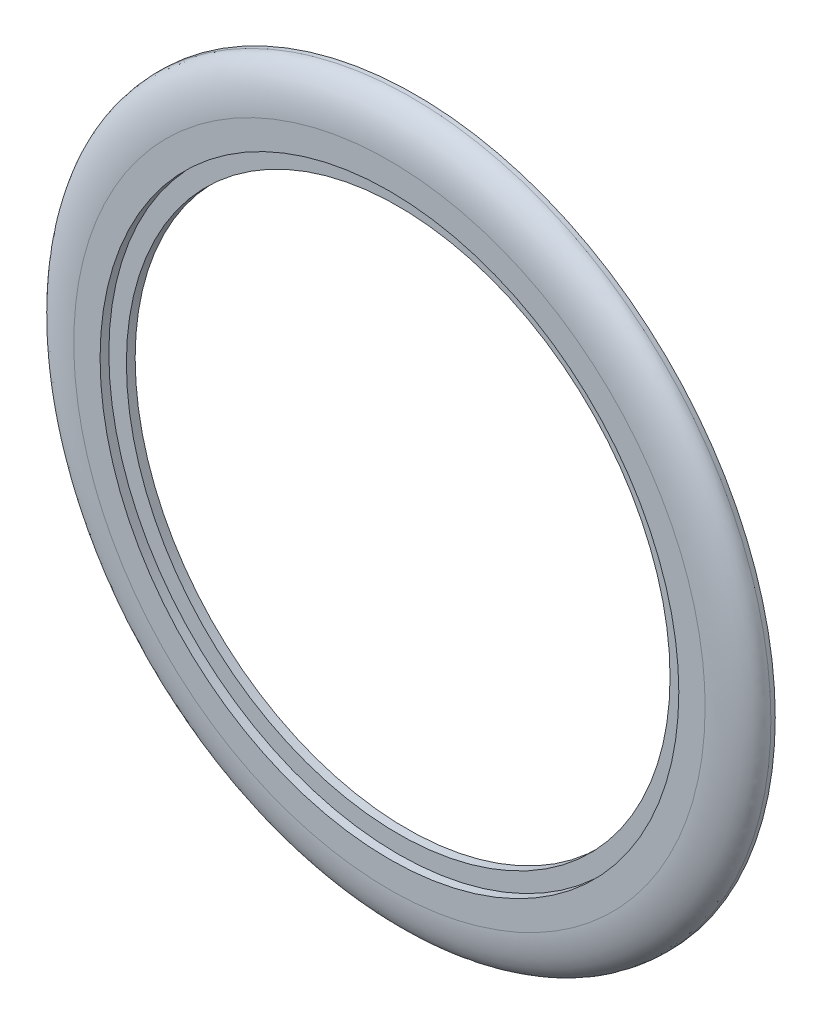
ISO-10303-21;
HEADER;
FILE_DESCRIPTION(('STEP AP214'),'2;1');
FILE_NAME('part.step','',(''),(''),'','','');
FILE_SCHEMA(('AUTOMOTIVE_DESIGN { 1 0 10303 214 1 1 1 1 }'));
ENDSEC;
DATA;
#1=APPLICATION_CONTEXT('core data for automotive mechanical design processes');
#2=APPLICATION_PROTOCOL_DEFINITION('international standard','automotive_design',2000,#1);
#3=PRODUCT_CONTEXT('',#1,'mechanical');
#4=PRODUCT('Part','Part','',(#3));
#5=PRODUCT_RELATED_PRODUCT_CATEGORY('part','',(#4));
#6=PRODUCT_DEFINITION_FORMATION('','',#4);
#7=PRODUCT_DEFINITION_CONTEXT('part definition',#1,'design');
#8=PRODUCT_DEFINITION('design','',#6,#7);
#9=PRODUCT_DEFINITION_SHAPE('','',#8);
#10=(LENGTH_UNIT() NAMED_UNIT(*) SI_UNIT(.MILLI.,.METRE.));
#11=(NAMED_UNIT(*) PLANE_ANGLE_UNIT() SI_UNIT($,.RADIAN.));
#12=(NAMED_UNIT(*) SI_UNIT($,.STERADIAN.) SOLID_ANGLE_UNIT());
#13=UNCERTAINTY_MEASURE_WITH_UNIT(LENGTH_MEASURE(1.E-05),#10,'distance_accuracy_value','');
#14=(GEOMETRIC_REPRESENTATION_CONTEXT(3) GLOBAL_UNCERTAINTY_ASSIGNED_CONTEXT((#13)) GLOBAL_UNIT_ASSIGNED_CONTEXT((#10,
#11,#12)) REPRESENTATION_CONTEXT('',''));
#15=CARTESIAN_POINT('',(0.,0.,0.));
#16=DIRECTION('',(0.,0.,1.));
#17=DIRECTION('',(1.,0.,0.));
#18=AXIS2_PLACEMENT_3D('',#15,#16,#17);
#19=CARTESIAN_POINT('',(0.,0.,-0.150151751733781));
#20=DIRECTION('',(0.,0.,1.));
#21=DIRECTION('',(1.,0.,0.));
#22=AXIS2_PLACEMENT_3D('',#19,#20,#21);
#23=CYLINDRICAL_SURFACE('',#22,15.5);
#24=CARTESIAN_POINT('',(0.,0.,1.));
#25=DIRECTION('',(0.,0.,1.));
#26=DIRECTION('',(1.,0.,0.));
#27=AXIS2_PLACEMENT_3D('',#24,#25,#26);
#28=CIRCLE('',#27,15.5);
#29=CARTESIAN_POINT('',(15.5,0.,1.));
#30=VERTEX_POINT('',#29);
#31=EDGE_CURVE('E154',#30,#30,#28,.T.);
#32=ORIENTED_EDGE('',*,*,#31,.T.);
#33=EDGE_LOOP('',(#32));
#34=FACE_BOUND('',#33,.T.);
#35=CARTESIAN_POINT('',(0.,0.,0.5));
#36=DIRECTION('',(0.,0.,-1.));
#37=DIRECTION('',(-1.,0.,0.));
#38=AXIS2_PLACEMENT_3D('',#35,#36,#37);
#39=CIRCLE('',#38,15.5);
#40=CARTESIAN_POINT('',(-15.5,0.,0.5));
#41=VERTEX_POINT('',#40);
#42=EDGE_CURVE('E52',#41,#41,#39,.F.);
#43=ORIENTED_EDGE('',*,*,#42,.F.);
#44=EDGE_LOOP('',(#43));
#45=FACE_BOUND('',#44,.T.);
#46=ADVANCED_FACE('F44',(#34,#45),#23,.F.);
#47=CARTESIAN_POINT('',(0.,0.,1.5));
#48=DIRECTION('',(0.,0.,-1.));
#49=DIRECTION('',(-1.,0.,0.));
#50=AXIS2_PLACEMENT_3D('',#47,#48,#49);
#51=CYLINDRICAL_SURFACE('',#50,20.5);
#52=CARTESIAN_POINT('',(20.5,0.,0.25));
#53=CARTESIAN_POINT('',(20.5,1.34172186178781,0.25));
#54=CARTESIAN_POINT('',(20.3678551983372,2.68341054890061,0.25));
#55=CARTESIAN_POINT('',(19.8443412981953,5.31529265376065,0.25));
#56=CARTESIAN_POINT('',(19.4529851438268,6.60542099706243,0.25));
#57=CARTESIAN_POINT('',(18.426075689136,9.08459972990625,0.25));
#58=CARTESIAN_POINT('',(17.7905477795981,10.2735888206708,0.25));
#59=CARTESIAN_POINT('',(16.2997063248063,12.5047907331329,0.25));
#60=CARTESIAN_POINT('',(15.4444296412554,13.5469483873931,0.25));
#61=CARTESIAN_POINT('',(13.5469483873931,15.4444296412554,0.25));
#62=CARTESIAN_POINT('',(12.5047907331328,16.2997063248063,0.25));
#63=CARTESIAN_POINT('',(10.2735888206708,17.7905477795981,0.25));
#64=CARTESIAN_POINT('',(9.08459972990589,18.4260756891361,0.25));
#65=CARTESIAN_POINT('',(6.60542099706278,19.4529851438267,0.25));
#66=CARTESIAN_POINT('',(5.31529265375978,19.8443412981955,0.25));
#67=CARTESIAN_POINT('',(2.6834105489015,20.367855198337,0.25));
#68=CARTESIAN_POINT('',(1.34172186178046,20.5,0.25));
#69=CARTESIAN_POINT('',(-1.34172186178045,20.5,0.25));
#70=CARTESIAN_POINT('',(-2.68341054890148,20.367855198337,0.25));
#71=CARTESIAN_POINT('',(-5.31529265375976,19.8443412981955,0.25));
#72=CARTESIAN_POINT('',(-6.60542099706352,19.4529851438264,0.25));
#73=CARTESIAN_POINT('',(-9.08459972990518,18.4260756891364,0.25));
#74=CARTESIAN_POINT('',(-10.27358882067,17.7905477795986,0.25));
#75=CARTESIAN_POINT('',(-12.5047907331337,16.2997063248057,0.25));
#76=CARTESIAN_POINT('',(-13.5469483873938,15.4444296412547,0.25));
#77=CARTESIAN_POINT('',(-15.4444296412547,13.5469483873937,0.25));
#78=CARTESIAN_POINT('',(-16.2997063248051,12.5047907331346,0.25));
#79=CARTESIAN_POINT('',(-17.7905477795992,10.2735888206691,0.25));
#80=CARTESIAN_POINT('',(-18.4260756891358,9.08459972990664,0.25));
#81=CARTESIAN_POINT('',(-19.452985143827,6.6054209970621,0.25));
#82=CARTESIAN_POINT('',(-19.8443412981954,5.31529265376027,0.25));
#83=CARTESIAN_POINT('',(-20.3678551983371,2.68341054890101,0.25));
#84=CARTESIAN_POINT('',(-20.5,1.34172186178046,0.25));
#85=CARTESIAN_POINT('',(-20.5,-1.34172186178045,0.25));
#86=CARTESIAN_POINT('',(-20.3678551983371,-2.68341054890098,0.25));
#87=CARTESIAN_POINT('',(-19.8443412981954,-5.31529265376024,0.25));
#88=CARTESIAN_POINT('',(-19.4529851438273,-6.60542099706117,0.25));
#89=CARTESIAN_POINT('',(-18.4260756891355,-9.08459972990746,0.25));
#90=CARTESIAN_POINT('',(-17.7905477795993,-10.2735888206691,0.25));
#91=CARTESIAN_POINT('',(-16.2997063248051,-12.5047907331346,0.25));
#92=CARTESIAN_POINT('',(-15.4444296412557,-13.5469483873927,0.25));
#93=CARTESIAN_POINT('',(-13.5469483873927,-15.4444296412557,0.25));
#94=CARTESIAN_POINT('',(-12.5047907331339,-16.2997063248055,0.25));
#95=CARTESIAN_POINT('',(-10.2735888206698,-17.7905477795988,0.25));
#96=CARTESIAN_POINT('',(-9.08459972990617,-18.426075689136,0.25));
#97=CARTESIAN_POINT('',(-6.60542099706256,-19.4529851438268,0.25));
#98=CARTESIAN_POINT('',(-5.3152926537596,-19.8443412981955,0.25));
#99=CARTESIAN_POINT('',(-2.68341054890171,-20.3678551983369,0.25));
#100=CARTESIAN_POINT('',(-1.34172186178042,-20.5,0.25));
#101=CARTESIAN_POINT('',(1.34172186178049,-20.5,0.25));
#102=CARTESIAN_POINT('',(2.68341054890079,-20.3678551983371,0.25));
#103=CARTESIAN_POINT('',(5.31529265376044,-19.8443412981953,0.25));
#104=CARTESIAN_POINT('',(6.60542099706337,-19.4529851438264,0.25));
#105=CARTESIAN_POINT('',(9.08459972990525,-18.4260756891364,0.25));
#106=CARTESIAN_POINT('',(10.2735888206683,-17.7905477795997,0.25));
#107=CARTESIAN_POINT('',(12.5047907331353,-16.2997063248046,0.25));
#108=CARTESIAN_POINT('',(13.5469483873931,-15.4444296412553,0.25));
#109=CARTESIAN_POINT('',(15.4444296412553,-13.5469483873932,0.25));
#110=CARTESIAN_POINT('',(16.2997063248046,-12.5047907331354,0.25));
#111=CARTESIAN_POINT('',(17.7905477795997,-10.2735888206684,0.25));
#112=CARTESIAN_POINT('',(18.4260756891357,-9.0845997299069,0.25));
#113=CARTESIAN_POINT('',(19.4529851438271,-6.60542099706184,0.25));
#114=CARTESIAN_POINT('',(19.8443412981955,-5.3152926537597,0.25));
#115=CARTESIAN_POINT('',(20.367855198337,-2.68341054890161,0.25));
#116=CARTESIAN_POINT('',(20.5,-1.34172186178781,0.25));
#117=CARTESIAN_POINT('',(20.5,0.,0.25));
#118=(BOUNDED_CURVE() B_SPLINE_CURVE(3,(#52,#53,#54,#55,#56,#57,#58,#59,#60,#61,#62,#63,#64,#65,
#66,#67,#68,#69,#70,#71,#72,#73,#74,#75,#76,#77,#78,#79,#80,#81,#82,#83,#84,#85,#86,#87,#88,#89,
#90,#91,#92,#93,#94,#95,#96,#97,#98,#99,#100,#101,#102,#103,#104,#105,#106,#107,#108,#109,#110,
#111,#112,#113,#114,#115,#116,#117),.UNSPECIFIED.,.T.,.F.) B_SPLINE_CURVE_WITH_KNOTS((4,2,2,2,2,
2,2,2,2,2,2,2,2,2,2,2,2,2,2,2,2,2,2,2,2,2,2,2,2,2,2,2,4),(0.,0.196349540849362,
0.392699081698724,0.589048622548086,0.785398163397448,0.98174770424681,1.17809724509617,
1.37444678594553,1.5707963267949,1.76714586764426,1.96349540849362,2.15984494934298,
2.35619449019234,2.55254403104171,2.74889357189107,2.94524311274043,3.14159265358979,
3.33794219443916,3.53429173528852,3.73064127613788,3.92699081698724,4.1233403578366,
4.31968989868597,4.51603943953533,4.71238898038469,4.90873852123405,5.10508806208341,
5.30143760293278,5.49778714378214,5.6941366846315,5.89048622548086,6.08683576633022,
6.28318530717959),
.UNSPECIFIED.) CURVE() GEOMETRIC_REPRESENTATION_ITEM() RATIONAL_B_SPLINE_CURVE((1.,1.,1.,1.,1.,
1.,1.,1.,1.,1.,1.,1.,1.,1.,1.,1.,1.,1.,1.,1.,1.,1.,1.,1.,1.,1.,1.,1.,1.,1.,1.,1.,1.,1.,1.,1.,1.,
1.,1.,1.,1.,1.,1.,1.,1.,1.,1.,1.,1.,1.,1.,1.,1.,1.,1.,1.,1.,1.,1.,1.,1.,1.,1.,1.,1.,1.)) REPRESENTATION_ITEM(''));
#119=CARTESIAN_POINT('',(20.5,0.,0.25));
#120=VERTEX_POINT('',#119);
#121=EDGE_CURVE('E11',#120,#120,#118,.F.);
#122=ORIENTED_EDGE('',*,*,#121,.T.);
#123=EDGE_LOOP('',(#122));
#124=FACE_BOUND('',#123,.T.);
#125=CARTESIAN_POINT('',(0.,0.,0.));
#126=DIRECTION('',(0.,0.,1.));
#127=DIRECTION('',(1.,0.,0.));
#128=AXIS2_PLACEMENT_3D('',#125,#126,#127);
#129=CIRCLE('',#128,20.5);
#130=CARTESIAN_POINT('',(20.5,0.,0.));
#131=VERTEX_POINT('',#130);
#132=EDGE_CURVE('E64',#131,#131,#129,.T.);
#133=ORIENTED_EDGE('',*,*,#132,.T.);
#134=EDGE_LOOP('',(#133));
#135=FACE_BOUND('',#134,.T.);
#136=ADVANCED_FACE('F95',(#124,#135),#51,.T.);
#137=CARTESIAN_POINT('',(0.,0.,1.5));
#138=DIRECTION('',(0.,0.,1.));
#139=DIRECTION('',(1.,0.,0.));
#140=AXIS2_PLACEMENT_3D('',#137,#138,#139);
#141=PLANE('',#140);
#142=CARTESIAN_POINT('',(0.,0.,1.5));
#143=DIRECTION('',(0.,0.,1.));
#144=DIRECTION('',(1.,0.,0.));
#145=AXIS2_PLACEMENT_3D('',#142,#143,#144);
#146=CIRCLE('',#145,16.5);
#147=CARTESIAN_POINT('',(16.5,0.,1.5));
#148=VERTEX_POINT('',#147);
#149=EDGE_CURVE('E76',#148,#148,#146,.T.);
#150=ORIENTED_EDGE('',*,*,#149,.F.);
#151=EDGE_LOOP('',(#150));
#152=FACE_BOUND('',#151,.T.);
#153=CARTESIAN_POINT('',(18.,0.,1.5));
#154=CARTESIAN_POINT('',(18.,-1.17809724449661,1.5));
#155=CARTESIAN_POINT('',(17.8839704180491,-2.3561653600105,1.5));
#156=CARTESIAN_POINT('',(17.4242996764672,-4.66708623257016,1.5));
#157=CARTESIAN_POINT('',(17.0806698823861,-5.79988185107918,1.5));
#158=CARTESIAN_POINT('',(16.1789932880202,-7.9767217140641,1.5));
#159=CARTESIAN_POINT('',(15.6209687820875,-9.02071213522079,1.5));
#160=CARTESIAN_POINT('',(14.3119372608041,-10.9798162534849,1.5));
#161=CARTESIAN_POINT('',(13.5609626118337,-11.894881510882,1.5));
#162=CARTESIAN_POINT('',(11.8948815108819,-13.5609626118338,1.5));
#163=CARTESIAN_POINT('',(10.9798162534839,-14.3119372608041,1.5));
#164=CARTESIAN_POINT('',(9.02071213522179,-15.6209687820875,1.5));
#165=CARTESIAN_POINT('',(7.97672171406405,-16.1789932880222,1.5));
#166=CARTESIAN_POINT('',(5.79988185107913,-17.0806698823841,1.5));
#167=CARTESIAN_POINT('',(4.66708623256987,-17.4242996764651,1.5));
#168=CARTESIAN_POINT('',(2.35616536001072,-17.8839704180512,1.5));
#169=CARTESIAN_POINT('',(1.17809724449019,-18.,1.5));
#170=CARTESIAN_POINT('',(-1.17809724449013,-18.,1.5));
#171=CARTESIAN_POINT('',(-2.35616536001076,-17.8839704180512,1.5));
#172=CARTESIAN_POINT('',(-4.66708623256991,-17.4242996764651,1.5));
#173=CARTESIAN_POINT('',(-5.79988185107918,-17.0806698823841,1.5));
#174=CARTESIAN_POINT('',(-7.9767217140641,-16.1789932880222,1.5));
#175=CARTESIAN_POINT('',(-9.02071213522283,-15.6209687820875,1.5));
#176=CARTESIAN_POINT('',(-10.9798162534829,-14.3119372608041,1.5));
#177=CARTESIAN_POINT('',(-11.8948815108825,-13.5609626118353,1.5));
#178=CARTESIAN_POINT('',(-13.5609626118332,-11.8948815108804,1.5));
#179=CARTESIAN_POINT('',(-14.311937260804,-10.9798162534835,1.5));
#180=CARTESIAN_POINT('',(-15.6209687820877,-9.02071213522213,1.5));
#181=CARTESIAN_POINT('',(-16.1789932880207,-7.97672171406407,1.5));
#182=CARTESIAN_POINT('',(-17.0806698823857,-5.79988185107912,1.5));
#183=CARTESIAN_POINT('',(-17.4242996764653,-4.66708623256991,1.5));
#184=CARTESIAN_POINT('',(-17.883970418051,-2.35616536001068,1.5));
#185=CARTESIAN_POINT('',(-18.,-1.17809724449015,1.5));
#186=CARTESIAN_POINT('',(-18.,1.17809724449016,1.5));
#187=CARTESIAN_POINT('',(-17.883970418053,2.35616536001071,1.5));
#188=CARTESIAN_POINT('',(-17.4242996764633,4.66708623256993,1.5));
#189=CARTESIAN_POINT('',(-17.0806698823856,5.79988185107917,1.5));
#190=CARTESIAN_POINT('',(-16.1789932880207,7.97672171406412,1.5));
#191=CARTESIAN_POINT('',(-15.6209687820876,9.02071213522318,1.5));
#192=CARTESIAN_POINT('',(-14.311937260804,10.9798162534825,1.5));
#193=CARTESIAN_POINT('',(-13.5609626118343,11.8948815108825,1.5));
#194=CARTESIAN_POINT('',(-11.8948815108814,13.5609626118332,1.5));
#195=CARTESIAN_POINT('',(-10.9798162534835,14.311937260805,1.5));
#196=CARTESIAN_POINT('',(-9.02071213522213,15.6209687820866,1.5));
#197=CARTESIAN_POINT('',(-7.97672171406359,16.1789932880227,1.5));
#198=CARTESIAN_POINT('',(-5.79988185107966,17.0806698823836,1.5));
#199=CARTESIAN_POINT('',(-4.66708623256965,17.4242996764653,1.5));
#200=CARTESIAN_POINT('',(-2.35616536001094,17.883970418051,1.5));
#201=CARTESIAN_POINT('',(-1.17809724449015,18.,1.5));
#202=CARTESIAN_POINT('',(1.17809724449016,18.,1.5));
#203=CARTESIAN_POINT('',(2.35616536001096,17.883970418053,1.5));
#204=CARTESIAN_POINT('',(4.66708623256968,17.4242996764633,1.5));
#205=CARTESIAN_POINT('',(5.79988185107913,17.0806698823836,1.5));
#206=CARTESIAN_POINT('',(7.97672171406409,16.1789932880227,1.5));
#207=CARTESIAN_POINT('',(9.02071213522308,15.6209687820863,1.5));
#208=CARTESIAN_POINT('',(10.9798162534826,14.3119372608053,1.5));
#209=CARTESIAN_POINT('',(11.8948815108811,13.5609626118336,1.5));
#210=CARTESIAN_POINT('',(13.5609626118347,11.8948815108821,1.5));
#211=CARTESIAN_POINT('',(14.3119372608053,10.9798162534826,1.5));
#212=CARTESIAN_POINT('',(15.6209687820863,9.02071213522308,1.5));
#213=CARTESIAN_POINT('',(16.1789932880211,7.97672171406403,1.5));
#214=CARTESIAN_POINT('',(17.0806698823852,5.79988185107921,1.5));
#215=CARTESIAN_POINT('',(17.4242996764636,4.66708623256998,1.5));
#216=CARTESIAN_POINT('',(17.8839704180527,2.35616536001064,1.5));
#217=CARTESIAN_POINT('',(18.,1.17809724449661,1.5));
#218=CARTESIAN_POINT('',(18.,0.,1.5));
#219=(BOUNDED_CURVE() B_SPLINE_CURVE(3,(#153,#154,#155,#156,#157,#158,#159,#160,#161,#162,#163,
#164,#165,#166,#167,#168,#169,#170,#171,#172,#173,#174,#175,#176,#177,#178,#179,#180,#181,#182,
#183,#184,#185,#186,#187,#188,#189,#190,#191,#192,#193,#194,#195,#196,#197,#198,#199,#200,#201,
#202,#203,#204,#205,#206,#207,#208,#209,#210,#211,#212,#213,#214,#215,#216,#217,#218),
.UNSPECIFIED.,.T.,.F.) B_SPLINE_CURVE_WITH_KNOTS((4,2,2,2,2,2,2,2,2,2,2,2,2,2,2,2,2,2,2,2,2,2,2,
2,2,2,2,2,2,2,2,2,4),(0.,0.196349540849362,0.392699081698725,0.589048622548086,
0.785398163397448,0.981747704246811,1.17809724509617,1.37444678594553,1.5707963267949,
1.76714586764426,1.96349540849362,2.15984494934298,2.35619449019234,2.55254403104171,
2.74889357189107,2.94524311274043,3.14159265358979,3.33794219443916,3.53429173528852,
3.73064127613788,3.92699081698724,4.1233403578366,4.31968989868597,4.51603943953533,
4.71238898038469,4.90873852123405,5.10508806208341,5.30143760293278,5.49778714378214,
5.6941366846315,5.89048622548086,6.08683576633022,6.28318530717959),
.UNSPECIFIED.) CURVE() GEOMETRIC_REPRESENTATION_ITEM() RATIONAL_B_SPLINE_CURVE((1.,1.,1.,1.,1.,
1.,1.,1.,1.,1.,1.,1.,1.,1.,1.,1.,1.,1.,1.,1.,1.,1.,1.,1.,1.,1.,1.,1.,1.,1.,1.,1.,1.,1.,1.,1.,1.,
1.,1.,1.,1.,1.,1.,1.,1.,1.,1.,1.,1.,1.,1.,1.,1.,1.,1.,1.,1.,1.,1.,1.,1.,1.,1.,1.,1.,1.)) REPRESENTATION_ITEM(''));
#220=CARTESIAN_POINT('',(18.,0.,1.5));
#221=VERTEX_POINT('',#220);
#222=EDGE_CURVE('E57',#221,#221,#219,.F.);
#223=ORIENTED_EDGE('',*,*,#222,.T.);
#224=EDGE_LOOP('',(#223));
#225=FACE_BOUND('',#224,.T.);
#226=ADVANCED_FACE('F84',(#152,#225),#141,.T.);
#227=CARTESIAN_POINT('',(0.,0.,0.));
#228=DIRECTION('',(0.,0.,1.));
#229=DIRECTION('',(1.,0.,0.));
#230=AXIS2_PLACEMENT_3D('',#227,#228,#229);
#231=PLANE('',#230);
#232=CARTESIAN_POINT('',(0.,0.,0.));
#233=DIRECTION('',(0.,0.,-1.));
#234=DIRECTION('',(-1.,0.,0.));
#235=AXIS2_PLACEMENT_3D('',#232,#233,#234);
#236=CIRCLE('',#235,18.);
#237=CARTESIAN_POINT('',(-18.,0.,0.));
#238=VERTEX_POINT('',#237);
#239=EDGE_CURVE('E166',#238,#238,#236,.T.);
#240=ORIENTED_EDGE('',*,*,#239,.F.);
#241=EDGE_LOOP('',(#240));
#242=FACE_BOUND('',#241,.T.);
#243=ORIENTED_EDGE('',*,*,#132,.F.);
#244=EDGE_LOOP('',(#243));
#245=FACE_BOUND('',#244,.T.);
#246=ADVANCED_FACE('F94',(#242,#245),#231,.F.);
#247=CARTESIAN_POINT('',(18.,0.,1.5));
#248=CARTESIAN_POINT('',(18.,1.17809724449661,1.5));
#249=CARTESIAN_POINT('',(17.8839704180527,2.35616536001064,1.5));
#250=CARTESIAN_POINT('',(17.4242996764636,4.66708623256998,1.5));
#251=CARTESIAN_POINT('',(17.0806698823852,5.79988185107921,1.5));
#252=CARTESIAN_POINT('',(16.1789932880211,7.97672171406403,1.5));
#253=CARTESIAN_POINT('',(15.6209687820863,9.02071213522308,1.5));
#254=CARTESIAN_POINT('',(14.3119372608053,10.9798162534826,1.5));
#255=CARTESIAN_POINT('',(13.5609626118347,11.8948815108821,1.5));
#256=CARTESIAN_POINT('',(11.8948815108811,13.5609626118336,1.5));
#257=CARTESIAN_POINT('',(10.9798162534826,14.3119372608053,1.5));
#258=CARTESIAN_POINT('',(9.02071213522308,15.6209687820863,1.5));
#259=CARTESIAN_POINT('',(7.97672171406409,16.1789932880227,1.5));
#260=CARTESIAN_POINT('',(5.79988185107913,17.0806698823836,1.5));
#261=CARTESIAN_POINT('',(4.66708623256968,17.4242996764633,1.5));
#262=CARTESIAN_POINT('',(2.35616536001096,17.883970418053,1.5));
#263=CARTESIAN_POINT('',(1.17809724449016,18.,1.5));
#264=CARTESIAN_POINT('',(-1.17809724449015,18.,1.5));
#265=CARTESIAN_POINT('',(-2.35616536001094,17.883970418051,1.5));
#266=CARTESIAN_POINT('',(-4.66708623256965,17.4242996764653,1.5));
#267=CARTESIAN_POINT('',(-5.79988185107966,17.0806698823836,1.5));
#268=CARTESIAN_POINT('',(-7.97672171406359,16.1789932880227,1.5));
#269=CARTESIAN_POINT('',(-9.02071213522213,15.6209687820866,1.5));
#270=CARTESIAN_POINT('',(-10.9798162534835,14.311937260805,1.5));
#271=CARTESIAN_POINT('',(-11.8948815108814,13.5609626118332,1.5));
#272=CARTESIAN_POINT('',(-13.5609626118343,11.8948815108825,1.5));
#273=CARTESIAN_POINT('',(-14.311937260804,10.9798162534825,1.5));
#274=CARTESIAN_POINT('',(-15.6209687820876,9.02071213522318,1.5));
#275=CARTESIAN_POINT('',(-16.1789932880207,7.97672171406412,1.5));
#276=CARTESIAN_POINT('',(-17.0806698823856,5.79988185107917,1.5));
#277=CARTESIAN_POINT('',(-17.4242996764633,4.66708623256993,1.5));
#278=CARTESIAN_POINT('',(-17.883970418053,2.35616536001071,1.5));
#279=CARTESIAN_POINT('',(-18.,1.17809724449016,1.5));
#280=CARTESIAN_POINT('',(-18.,-1.17809724449015,1.5));
#281=CARTESIAN_POINT('',(-17.883970418051,-2.35616536001068,1.5));
#282=CARTESIAN_POINT('',(-17.4242996764653,-4.66708623256991,1.5));
#283=CARTESIAN_POINT('',(-17.0806698823857,-5.79988185107912,1.5));
#284=CARTESIAN_POINT('',(-16.1789932880207,-7.97672171406407,1.5));
#285=CARTESIAN_POINT('',(-15.6209687820877,-9.02071213522213,1.5));
#286=CARTESIAN_POINT('',(-14.311937260804,-10.9798162534835,1.5));
#287=CARTESIAN_POINT('',(-13.5609626118332,-11.8948815108804,1.5));
#288=CARTESIAN_POINT('',(-11.8948815108825,-13.5609626118353,1.5));
#289=CARTESIAN_POINT('',(-10.9798162534829,-14.3119372608041,1.5));
#290=CARTESIAN_POINT('',(-9.02071213522283,-15.6209687820875,1.5));
#291=CARTESIAN_POINT('',(-7.9767217140641,-16.1789932880222,1.5));
#292=CARTESIAN_POINT('',(-5.79988185107918,-17.0806698823841,1.5));
#293=CARTESIAN_POINT('',(-4.66708623256991,-17.4242996764651,1.5));
#294=CARTESIAN_POINT('',(-2.35616536001076,-17.8839704180512,1.5));
#295=CARTESIAN_POINT('',(-1.17809724449013,-18.,1.5));
#296=CARTESIAN_POINT('',(1.17809724449019,-18.,1.5));
#297=CARTESIAN_POINT('',(2.35616536001072,-17.8839704180512,1.5));
#298=CARTESIAN_POINT('',(4.66708623256987,-17.4242996764651,1.5));
#299=CARTESIAN_POINT('',(5.79988185107913,-17.0806698823841,1.5));
#300=CARTESIAN_POINT('',(7.97672171406405,-16.1789932880222,1.5));
#301=CARTESIAN_POINT('',(9.02071213522179,-15.6209687820875,1.5));
#302=CARTESIAN_POINT('',(10.9798162534839,-14.3119372608041,1.5));
#303=CARTESIAN_POINT('',(11.8948815108819,-13.5609626118338,1.5));
#304=CARTESIAN_POINT('',(13.5609626118337,-11.894881510882,1.5));
#305=CARTESIAN_POINT('',(14.3119372608041,-10.9798162534849,1.5));
#306=CARTESIAN_POINT('',(15.6209687820875,-9.02071213522079,1.5));
#307=CARTESIAN_POINT('',(16.1789932880202,-7.9767217140641,1.5));
#308=CARTESIAN_POINT('',(17.0806698823861,-5.79988185107918,1.5));
#309=CARTESIAN_POINT('',(17.4242996764672,-4.66708623257016,1.5));
#310=CARTESIAN_POINT('',(17.8839704180491,-2.3561653600105,1.5));
#311=CARTESIAN_POINT('',(18.,-1.17809724449661,1.5));
#312=CARTESIAN_POINT('',(18.,0.,1.5));
#313=CARTESIAN_POINT('',(20.5,0.,1.5));
#314=CARTESIAN_POINT('',(20.5,1.34172186178781,1.5));
#315=CARTESIAN_POINT('',(20.3678551983387,2.68341054890093,1.49999999999987));
#316=CARTESIAN_POINT('',(19.8443412981937,5.31529265376033,1.50000000000013));
#317=CARTESIAN_POINT('',(19.4529851438275,6.60542099706271,1.5));
#318=CARTESIAN_POINT('',(18.4260756891353,9.08459972990597,1.5));
#319=CARTESIAN_POINT('',(17.7905477795979,10.2735888206708,1.5));
#320=CARTESIAN_POINT('',(16.2997063248064,12.5047907331329,1.5));
#321=CARTESIAN_POINT('',(15.4444296412559,13.5469483873936,1.50000000000026));
#322=CARTESIAN_POINT('',(13.5469483873926,15.4444296412549,1.49999999999975));
#323=CARTESIAN_POINT('',(12.5047907331329,16.2997063248064,1.5));
#324=CARTESIAN_POINT('',(10.2735888206708,17.7905477795979,1.5));
#325=CARTESIAN_POINT('',(9.08459972990618,18.4260756891368,1.49999999999987));
#326=CARTESIAN_POINT('',(6.60542099706249,19.452985143826,1.50000000000013));
#327=CARTESIAN_POINT('',(5.31529265375976,19.8443412981954,1.5));
#328=CARTESIAN_POINT('',(2.68341054890153,20.3678551983371,1.5));
#329=CARTESIAN_POINT('',(1.34172186178046,20.5,1.5));
#330=CARTESIAN_POINT('',(-1.34172186178045,20.5,1.5));
#331=CARTESIAN_POINT('',(-2.6834105489015,20.3678551983371,1.5));
#332=CARTESIAN_POINT('',(-5.31529265375973,19.8443412981954,1.5));
#333=CARTESIAN_POINT('',(-6.6054209970625,19.4529851438239,1.5));
#334=CARTESIAN_POINT('',(-9.08459972990619,18.4260756891389,1.5));
#335=CARTESIAN_POINT('',(-10.2735888206706,17.7905477795994,1.5));
#336=CARTESIAN_POINT('',(-12.5047907331331,16.2997063248049,1.5));
#337=CARTESIAN_POINT('',(-13.5469483873927,15.4444296412547,1.49999999999732));
#338=CARTESIAN_POINT('',(-15.4444296412557,13.5469483873937,1.50000000000268));
#339=CARTESIAN_POINT('',(-16.2997063248029,12.5047907331331,1.49999999999834));
#340=CARTESIAN_POINT('',(-17.7905477796015,10.2735888206706,1.50000000000166));
#341=CARTESIAN_POINT('',(-18.4260756891348,9.08459972990621,1.5));
#342=CARTESIAN_POINT('',(-19.452985143828,6.60542099706252,1.5));
#343=CARTESIAN_POINT('',(-19.8443412981954,5.31529265376078,1.49999999999987));
#344=CARTESIAN_POINT('',(-20.3678551983371,2.6834105489005,1.50000000000013));
#345=CARTESIAN_POINT('',(-20.5,1.34172186178046,1.5));
#346=CARTESIAN_POINT('',(-20.5,-1.34172186178045,1.5));
#347=CARTESIAN_POINT('',(-20.3678551983371,-2.68341054890098,1.49999999999987));
#348=CARTESIAN_POINT('',(-19.8443412981954,-5.31529265376024,1.50000000000013));
#349=CARTESIAN_POINT('',(-19.452985143828,-6.60542099706145,1.50000000000038));
#350=CARTESIAN_POINT('',(-18.4260756891348,-9.08459972990718,1.49999999999962));
#351=CARTESIAN_POINT('',(-17.7905477796015,-10.2735888206706,1.5));
#352=CARTESIAN_POINT('',(-16.2997063248029,-12.5047907331331,1.5));
#353=CARTESIAN_POINT('',(-15.4444296412547,-13.5469483873907,1.49999999999846));
#354=CARTESIAN_POINT('',(-13.5469483873937,-15.4444296412578,1.50000000000153));
#355=CARTESIAN_POINT('',(-12.5047907331344,-16.2997063248047,1.50000000000153));
#356=CARTESIAN_POINT('',(-10.2735888206693,-17.7905477795996,1.49999999999847));
#357=CARTESIAN_POINT('',(-9.08459972990652,-18.4260756891368,1.49999999999987));
#358=CARTESIAN_POINT('',(-6.60542099706221,-19.4529851438259,1.50000000000013));
#359=CARTESIAN_POINT('',(-5.3152926537605,-19.8443412981975,1.5));
#360=CARTESIAN_POINT('',(-2.68341054890081,-20.367855198335,1.5));
#361=CARTESIAN_POINT('',(-1.34172186178042,-20.499999999998,1.49999999999987));
#362=CARTESIAN_POINT('',(1.34172186178049,-20.500000000002,1.50000000000013));
#363=CARTESIAN_POINT('',(2.68341054890077,-20.367855198337,1.5));
#364=CARTESIAN_POINT('',(5.31529265376045,-19.8443412981954,1.5));
#365=CARTESIAN_POINT('',(6.60542099706318,-19.4529851438259,1.50000000000051));
#366=CARTESIAN_POINT('',(9.08459972990544,-18.4260756891368,1.49999999999949));
#367=CARTESIAN_POINT('',(10.2735888206682,-17.7905477795996,1.49999999999821));
#368=CARTESIAN_POINT('',(12.5047907331354,-16.2997063248048,1.50000000000179));
#369=CARTESIAN_POINT('',(13.5469483873931,-15.4444296412553,1.5));
#370=CARTESIAN_POINT('',(15.4444296412553,-13.5469483873932,1.5));
#371=CARTESIAN_POINT('',(16.2997063248047,-12.5047907331365,1.50000000000192));
#372=CARTESIAN_POINT('',(17.7905477795996,-10.2735888206672,1.49999999999808));
#373=CARTESIAN_POINT('',(18.4260756891348,-9.08459972990652,1.50000000000051));
#374=CARTESIAN_POINT('',(19.452985143828,-6.60542099706221,1.49999999999949));
#375=CARTESIAN_POINT('',(19.8443412981995,-5.31529265375999,1.49999999999974));
#376=CARTESIAN_POINT('',(20.367855198333,-2.68341054890133,1.50000000000026));
#377=CARTESIAN_POINT('',(20.5,-1.34172186178781,1.5));
#378=CARTESIAN_POINT('',(20.5,0.,1.5));
#379=CARTESIAN_POINT('',(20.5,0.,0.25));
#380=CARTESIAN_POINT('',(20.5,1.34172186178781,0.25));
#381=CARTESIAN_POINT('',(20.3678551983372,2.68341054890061,0.25));
#382=CARTESIAN_POINT('',(19.8443412981953,5.31529265376065,0.25));
#383=CARTESIAN_POINT('',(19.4529851438268,6.60542099706243,0.25));
#384=CARTESIAN_POINT('',(18.426075689136,9.08459972990625,0.25));
#385=CARTESIAN_POINT('',(17.7905477795981,10.2735888206708,0.25));
#386=CARTESIAN_POINT('',(16.2997063248063,12.5047907331329,0.25));
#387=CARTESIAN_POINT('',(15.4444296412554,13.5469483873931,0.25));
#388=CARTESIAN_POINT('',(13.5469483873931,15.4444296412554,0.25));
#389=CARTESIAN_POINT('',(12.5047907331328,16.2997063248063,0.25));
#390=CARTESIAN_POINT('',(10.2735888206708,17.7905477795981,0.25));
#391=CARTESIAN_POINT('',(9.08459972990589,18.4260756891361,0.25));
#392=CARTESIAN_POINT('',(6.60542099706278,19.4529851438267,0.25));
#393=CARTESIAN_POINT('',(5.31529265375978,19.8443412981955,0.25));
#394=CARTESIAN_POINT('',(2.6834105489015,20.367855198337,0.25));
#395=CARTESIAN_POINT('',(1.34172186178046,20.5,0.25));
#396=CARTESIAN_POINT('',(-1.34172186178045,20.5,0.25));
#397=CARTESIAN_POINT('',(-2.68341054890148,20.367855198337,0.25));
#398=CARTESIAN_POINT('',(-5.31529265375976,19.8443412981955,0.25));
#399=CARTESIAN_POINT('',(-6.60542099706352,19.4529851438264,0.25));
#400=CARTESIAN_POINT('',(-9.08459972990518,18.4260756891364,0.25));
#401=CARTESIAN_POINT('',(-10.27358882067,17.7905477795986,0.25));
#402=CARTESIAN_POINT('',(-12.5047907331337,16.2997063248057,0.25));
#403=CARTESIAN_POINT('',(-13.5469483873938,15.4444296412547,0.25));
#404=CARTESIAN_POINT('',(-15.4444296412547,13.5469483873937,0.25));
#405=CARTESIAN_POINT('',(-16.2997063248051,12.5047907331346,0.25));
#406=CARTESIAN_POINT('',(-17.7905477795992,10.2735888206691,0.25));
#407=CARTESIAN_POINT('',(-18.4260756891358,9.08459972990664,0.25));
#408=CARTESIAN_POINT('',(-19.452985143827,6.6054209970621,0.25));
#409=CARTESIAN_POINT('',(-19.8443412981954,5.31529265376027,0.25));
#410=CARTESIAN_POINT('',(-20.3678551983371,2.68341054890101,0.25));
#411=CARTESIAN_POINT('',(-20.5,1.34172186178046,0.25));
#412=CARTESIAN_POINT('',(-20.5,-1.34172186178045,0.25));
#413=CARTESIAN_POINT('',(-20.3678551983371,-2.68341054890098,0.25));
#414=CARTESIAN_POINT('',(-19.8443412981954,-5.31529265376024,0.25));
#415=CARTESIAN_POINT('',(-19.4529851438273,-6.60542099706117,0.25));
#416=CARTESIAN_POINT('',(-18.4260756891355,-9.08459972990746,0.25));
#417=CARTESIAN_POINT('',(-17.7905477795993,-10.2735888206691,0.25));
#418=CARTESIAN_POINT('',(-16.2997063248051,-12.5047907331346,0.25));
#419=CARTESIAN_POINT('',(-15.4444296412557,-13.5469483873927,0.25));
#420=CARTESIAN_POINT('',(-13.5469483873927,-15.4444296412557,0.25));
#421=CARTESIAN_POINT('',(-12.5047907331339,-16.2997063248055,0.25));
#422=CARTESIAN_POINT('',(-10.2735888206698,-17.7905477795988,0.25));
#423=CARTESIAN_POINT('',(-9.08459972990617,-18.426075689136,0.25));
#424=CARTESIAN_POINT('',(-6.60542099706256,-19.4529851438268,0.25));
#425=CARTESIAN_POINT('',(-5.3152926537596,-19.8443412981955,0.25));
#426=CARTESIAN_POINT('',(-2.68341054890171,-20.3678551983369,0.25));
#427=CARTESIAN_POINT('',(-1.34172186178042,-20.5,0.25));
#428=CARTESIAN_POINT('',(1.34172186178049,-20.5,0.25));
#429=CARTESIAN_POINT('',(2.68341054890079,-20.3678551983371,0.25));
#430=CARTESIAN_POINT('',(5.31529265376044,-19.8443412981953,0.25));
#431=CARTESIAN_POINT('',(6.60542099706337,-19.4529851438264,0.25));
#432=CARTESIAN_POINT('',(9.08459972990525,-18.4260756891364,0.25));
#433=CARTESIAN_POINT('',(10.2735888206683,-17.7905477795997,0.25));
#434=CARTESIAN_POINT('',(12.5047907331353,-16.2997063248046,0.25));
#435=CARTESIAN_POINT('',(13.5469483873931,-15.4444296412553,0.25));
#436=CARTESIAN_POINT('',(15.4444296412553,-13.5469483873932,0.25));
#437=CARTESIAN_POINT('',(16.2997063248046,-12.5047907331354,0.25));
#438=CARTESIAN_POINT('',(17.7905477795997,-10.2735888206684,0.25));
#439=CARTESIAN_POINT('',(18.4260756891357,-9.0845997299069,0.25));
#440=CARTESIAN_POINT('',(19.4529851438271,-6.60542099706184,0.25));
#441=CARTESIAN_POINT('',(19.8443412981955,-5.3152926537597,0.25));
#442=CARTESIAN_POINT('',(20.367855198337,-2.68341054890161,0.25));
#443=CARTESIAN_POINT('',(20.5,-1.34172186178781,0.25));
#444=CARTESIAN_POINT('',(20.5,0.,0.25));
#445=(BOUNDED_SURFACE() B_SPLINE_SURFACE(2,3,((#247,#248,#249,#250,#251,#252,#253,#254,#255,
#256,#257,#258,#259,#260,#261,#262,#263,#264,#265,#266,#267,#268,#269,#270,#271,#272,#273,#274,
#275,#276,#277,#278,#279,#280,#281,#282,#283,#284,#285,#286,#287,#288,#289,#290,#291,#292,#293,
#294,#295,#296,#297,#298,#299,#300,#301,#302,#303,#304,#305,#306,#307,#308,#309,#310,#311,#312),
(#313,#314,#315,#316,#317,#318,#319,#320,#321,#322,#323,#324,#325,#326,#327,#328,#329,#330,#331,
#332,#333,#334,#335,#336,#337,#338,#339,#340,#341,#342,#343,#344,#345,#346,#347,#348,#349,#350,
#351,#352,#353,#354,#355,#356,#357,#358,#359,#360,#361,#362,#363,#364,#365,#366,#367,#368,#369,
#370,#371,#372,#373,#374,#375,#376,#377,#378),(#379,#380,#381,#382,#383,#384,#385,#386,#387,
#388,#389,#390,#391,#392,#393,#394,#395,#396,#397,#398,#399,#400,#401,#402,#403,#404,#405,#406,
#407,#408,#409,#410,#411,#412,#413,#414,#415,#416,#417,#418,#419,#420,#421,#422,#423,#424,#425,
#426,#427,#428,#429,#430,#431,#432,#433,#434,#435,#436,#437,#438,#439,#440,#441,#442,#443,
#444)),.UNSPECIFIED.,.F.,.T.,.F.) B_SPLINE_SURFACE_WITH_KNOTS((3,3),(4,2,2,2,2,2,2,2,2,2,2,2,2,
2,2,2,2,2,2,2,2,2,2,2,2,2,2,2,2,2,2,2,4),(0.,1.),(0.,0.196349540849362,0.392699081698724,
0.589048622548086,0.785398163397448,0.98174770424681,1.17809724509617,1.37444678594553,
1.5707963267949,1.76714586764426,1.96349540849362,2.15984494934298,2.35619449019234,
2.55254403104171,2.74889357189107,2.94524311274043,3.14159265358979,3.33794219443916,
3.53429173528852,3.73064127613788,3.92699081698724,4.1233403578366,4.31968989868597,
4.51603943953533,4.71238898038469,4.90873852123405,5.10508806208341,5.30143760293278,
5.49778714378214,5.6941366846315,5.89048622548086,6.08683576633022,6.28318530717959),
.UNSPECIFIED.) GEOMETRIC_REPRESENTATION_ITEM() RATIONAL_B_SPLINE_SURFACE(((1.,1.,1.,1.,1.,1.,1.,
1.,1.,1.,1.,1.,1.,1.,1.,1.,1.,1.,1.,1.,1.,1.,1.,1.,1.,1.,1.,1.,1.,1.,1.,1.,1.,1.,1.,1.,1.,1.,1.,
1.,1.,1.,1.,1.,1.,1.,1.,1.,1.,1.,1.,1.,1.,1.,1.,1.,1.,1.,1.,1.,1.,1.,1.,1.,1.,1.),
(0.707106781186548,0.707106781186548,0.707106781186548,0.707106781186548,0.707106781186548,
0.707106781186548,0.707106781186548,0.707106781186548,0.707106781186547,0.707106781186547,
0.707106781186548,0.707106781186548,0.707106781186548,0.707106781186548,0.707106781186548,
0.707106781186548,0.707106781186548,0.707106781186548,0.707106781186548,0.707106781186548,
0.707106781186548,0.707106781186548,0.707106781186548,0.707106781186548,0.707106781186548,
0.707106781186548,0.707106781186548,0.707106781186548,0.707106781186547,0.707106781186547,
0.707106781186548,0.707106781186548,0.707106781186548,0.707106781186548,0.707106781186548,
0.707106781186548,0.707106781186547,0.707106781186547,0.707106781186548,0.707106781186548,
0.707106781186548,0.707106781186548,0.707106781186548,0.707106781186548,0.707106781186548,
0.707106781186548,0.707106781186548,0.707106781186548,0.707106781186548,0.707106781186548,
0.707106781186548,0.707106781186548,0.707106781186548,0.707106781186548,0.707106781186548,
0.707106781186548,0.707106781186548,0.707106781186548,0.707106781186548,0.707106781186548,
0.707106781186548,0.707106781186548,0.707106781186548,0.707106781186548,0.707106781186548,
0.707106781186548),(1.,1.,1.,1.,1.,1.,1.,1.,1.,1.,1.,1.,1.,1.,1.,1.,1.,1.,1.,1.,1.,1.,1.,1.,1.,
1.,1.,1.,1.,1.,1.,1.,1.,1.,1.,1.,1.,1.,1.,1.,1.,1.,1.,1.,1.,1.,1.,1.,1.,1.,1.,1.,1.,1.,1.,1.,1.,
1.,1.,1.,1.,1.,1.,1.,1.,1.))) REPRESENTATION_ITEM('') SURFACE());
#446=ORIENTED_EDGE('',*,*,#121,.F.);
#447=EDGE_LOOP('',(#446));
#448=FACE_BOUND('',#447,.T.);
#449=ORIENTED_EDGE('',*,*,#222,.F.);
#450=EDGE_LOOP('',(#449));
#451=FACE_BOUND('',#450,.T.);
#452=ADVANCED_FACE('F47',(#448,#451),#445,.T.);
#453=CARTESIAN_POINT('',(0.,0.,1.));
#454=DIRECTION('',(0.,0.,1.));
#455=DIRECTION('',(1.,0.,0.));
#456=AXIS2_PLACEMENT_3D('',#453,#454,#455);
#457=CYLINDRICAL_SURFACE('',#456,16.5);
#458=CARTESIAN_POINT('',(0.,0.,1.));
#459=DIRECTION('',(0.,0.,1.));
#460=DIRECTION('',(1.,0.,0.));
#461=AXIS2_PLACEMENT_3D('',#458,#459,#460);
#462=CIRCLE('',#461,16.5);
#463=CARTESIAN_POINT('',(16.5,0.,1.));
#464=VERTEX_POINT('',#463);
#465=EDGE_CURVE('E70',#464,#464,#462,.T.);
#466=ORIENTED_EDGE('',*,*,#465,.F.);
#467=EDGE_LOOP('',(#466));
#468=FACE_BOUND('',#467,.T.);
#469=ORIENTED_EDGE('',*,*,#149,.T.);
#470=EDGE_LOOP('',(#469));
#471=FACE_BOUND('',#470,.T.);
#472=ADVANCED_FACE('F97',(#468,#471),#457,.F.);
#473=CARTESIAN_POINT('',(0.,0.,1.));
#474=DIRECTION('',(0.,0.,1.));
#475=DIRECTION('',(1.,0.,0.));
#476=AXIS2_PLACEMENT_3D('',#473,#474,#475);
#477=PLANE('',#476);
#478=ORIENTED_EDGE('',*,*,#31,.F.);
#479=EDGE_LOOP('',(#478));
#480=FACE_BOUND('',#479,.T.);
#481=ORIENTED_EDGE('',*,*,#465,.T.);
#482=EDGE_LOOP('',(#481));
#483=FACE_BOUND('',#482,.T.);
#484=ADVANCED_FACE('F133',(#480,#483),#477,.T.);
#485=CARTESIAN_POINT('',(0.,0.,0.5));
#486=DIRECTION('',(0.,0.,-1.));
#487=DIRECTION('',(-1.,0.,0.));
#488=AXIS2_PLACEMENT_3D('',#485,#486,#487);
#489=PLANE('',#488);
#490=CARTESIAN_POINT('',(0.,0.,0.5));
#491=DIRECTION('',(0.,0.,-1.));
#492=DIRECTION('',(-1.,0.,0.));
#493=AXIS2_PLACEMENT_3D('',#490,#491,#492);
#494=CIRCLE('',#493,18.);
#495=CARTESIAN_POINT('',(-18.,0.,0.5));
#496=VERTEX_POINT('',#495);
#497=EDGE_CURVE('E164',#496,#496,#494,.T.);
#498=ORIENTED_EDGE('',*,*,#497,.T.);
#499=EDGE_LOOP('',(#498));
#500=FACE_BOUND('',#499,.T.);
#501=ORIENTED_EDGE('',*,*,#42,.T.);
#502=EDGE_LOOP('',(#501));
#503=FACE_BOUND('',#502,.T.);
#504=ADVANCED_FACE('F146',(#500,#503),#489,.T.);
#505=CARTESIAN_POINT('',(0.,0.,0.5));
#506=DIRECTION('',(0.,0.,-1.));
#507=DIRECTION('',(-1.,0.,0.));
#508=AXIS2_PLACEMENT_3D('',#505,#506,#507);
#509=CYLINDRICAL_SURFACE('',#508,18.);
#510=ORIENTED_EDGE('',*,*,#497,.F.);
#511=EDGE_LOOP('',(#510));
#512=FACE_BOUND('',#511,.T.);
#513=ORIENTED_EDGE('',*,*,#239,.T.);
#514=EDGE_LOOP('',(#513));
#515=FACE_BOUND('',#514,.T.);
#516=ADVANCED_FACE('F143',(#512,#515),#509,.F.);
#517=CLOSED_SHELL('',(#46,#136,#226,#246,#452,#472,#484,#504,#516));
#518=MANIFOLD_SOLID_BREP('B2',#517);
#519=ADVANCED_BREP_SHAPE_REPRESENTATION('',(#18,#518),#14);
#520=SHAPE_DEFINITION_REPRESENTATION(#9,#519);
ENDSEC;
END-ISO-10303-21;
